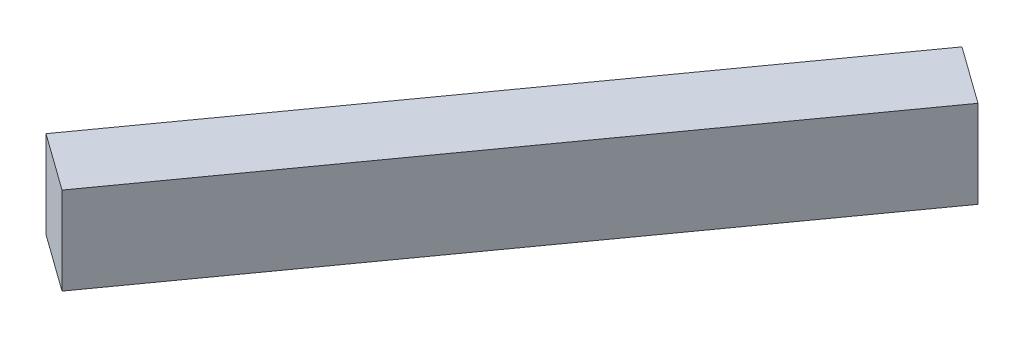
ISO-10303-21;
HEADER;
FILE_DESCRIPTION(('STEP AP214'),'2;1');
FILE_NAME('part.step','',(''),(''),'','','');
FILE_SCHEMA(('AUTOMOTIVE_DESIGN { 1 0 10303 214 1 1 1 1 }'));
ENDSEC;
DATA;
#1=APPLICATION_CONTEXT('core data for automotive mechanical design processes');
#2=APPLICATION_PROTOCOL_DEFINITION('international standard','automotive_design',2000,#1);
#3=PRODUCT_CONTEXT('',#1,'mechanical');
#4=PRODUCT('Part','Part','',(#3));
#5=PRODUCT_RELATED_PRODUCT_CATEGORY('part','',(#4));
#6=PRODUCT_DEFINITION_FORMATION('','',#4);
#7=PRODUCT_DEFINITION_CONTEXT('part definition',#1,'design');
#8=PRODUCT_DEFINITION('design','',#6,#7);
#9=PRODUCT_DEFINITION_SHAPE('','',#8);
#10=(LENGTH_UNIT() NAMED_UNIT(*) SI_UNIT(.MILLI.,.METRE.));
#11=(NAMED_UNIT(*) PLANE_ANGLE_UNIT() SI_UNIT($,.RADIAN.));
#12=(NAMED_UNIT(*) SI_UNIT($,.STERADIAN.) SOLID_ANGLE_UNIT());
#13=UNCERTAINTY_MEASURE_WITH_UNIT(LENGTH_MEASURE(1.E-05),#10,'distance_accuracy_value','');
#14=(GEOMETRIC_REPRESENTATION_CONTEXT(3) GLOBAL_UNCERTAINTY_ASSIGNED_CONTEXT((#13)) GLOBAL_UNIT_ASSIGNED_CONTEXT((#10,
#11,#12)) REPRESENTATION_CONTEXT('',''));
#15=CARTESIAN_POINT('',(0.,0.,0.));
#16=DIRECTION('',(0.,0.,1.));
#17=DIRECTION('',(1.,0.,0.));
#18=AXIS2_PLACEMENT_3D('',#15,#16,#17);
#19=CARTESIAN_POINT('',(10.4156583664926,7.874,-14.6777818352917));
#20=DIRECTION('',(0.812300744526054,0.,0.583238802243488));
#21=DIRECTION('',(0.583238802243488,0.,-0.812300744526054));
#22=AXIS2_PLACEMENT_3D('',#19,#20,#21);
#23=PLANE('',#22);
#24=DIRECTION('',(0.,1.,0.));
#25=VECTOR('',#24,1.);
#26=CARTESIAN_POINT('',(10.4156583664926,7.874,-14.6777818352917));
#27=LINE('',#26,#25);
#28=CARTESIAN_POINT('',(10.4156583664926,7.62,-14.6777818352917));
#29=VERTEX_POINT('',#28);
#30=CARTESIAN_POINT('',(10.4156583664926,7.874,-14.6777818352917));
#31=VERTEX_POINT('',#30);
#32=EDGE_CURVE('E20',#29,#31,#27,.T.);
#33=ORIENTED_EDGE('',*,*,#32,.T.);
#34=DIRECTION('',(0.583238802243481,0.,-0.812300744526059));
#35=VECTOR('',#34,1.);
#36=CARTESIAN_POINT('',(10.4156583664926,7.874,-14.6777818352917));
#37=LINE('',#36,#35);
#38=CARTESIAN_POINT('',(11.5267282847664,7.874,-16.2252147536138));
#39=VERTEX_POINT('',#38);
#40=EDGE_CURVE('E55',#31,#39,#37,.T.);
#41=ORIENTED_EDGE('',*,*,#40,.T.);
#42=DIRECTION('',(0.,1.,0.));
#43=VECTOR('',#42,1.);
#44=CARTESIAN_POINT('',(11.5267282847664,7.874,-16.2252147536138));
#45=LINE('',#44,#43);
#46=CARTESIAN_POINT('',(11.5267282847664,7.62,-16.2252147536138));
#47=VERTEX_POINT('',#46);
#48=EDGE_CURVE('E76',#39,#47,#45,.F.);
#49=ORIENTED_EDGE('',*,*,#48,.T.);
#50=DIRECTION('',(0.583238802243481,0.,-0.812300744526059));
#51=VECTOR('',#50,1.);
#52=CARTESIAN_POINT('',(10.4156583664926,7.62,-14.6777818352917));
#53=LINE('',#52,#51);
#54=EDGE_CURVE('E58',#29,#47,#53,.T.);
#55=ORIENTED_EDGE('',*,*,#54,.F.);
#56=EDGE_LOOP('',(#33,#41,#49,#55));
#57=FACE_BOUND('',#56,.T.);
#58=ADVANCED_FACE('F17',(#57),#23,.F.);
#59=CARTESIAN_POINT('',(10.4156583664926,7.874,-14.6777818352917));
#60=DIRECTION('',(0.583238802243484,0.,-0.812300744526057));
#61=DIRECTION('',(-0.812300744526057,0.,-0.583238802243484));
#62=AXIS2_PLACEMENT_3D('',#59,#60,#61);
#63=PLANE('',#62);
#64=DIRECTION('',(0.,1.,0.));
#65=VECTOR('',#64,1.);
#66=CARTESIAN_POINT('',(10.5807178777803,7.874,-14.5592677106758));
#67=LINE('',#66,#65);
#68=CARTESIAN_POINT('',(10.5807178777803,7.62,-14.5592677106758));
#69=VERTEX_POINT('',#68);
#70=CARTESIAN_POINT('',(10.5807178777803,7.874,-14.5592677106758));
#71=VERTEX_POINT('',#70);
#72=EDGE_CURVE('E73',#69,#71,#67,.T.);
#73=ORIENTED_EDGE('',*,*,#72,.T.);
#74=DIRECTION('',(-0.812300744526004,0.,-0.583238802243557));
#75=VECTOR('',#74,1.);
#76=CARTESIAN_POINT('',(10.5807178777803,7.874,-14.5592677106758));
#77=LINE('',#76,#75);
#78=EDGE_CURVE('E63',#71,#31,#77,.T.);
#79=ORIENTED_EDGE('',*,*,#78,.T.);
#80=ORIENTED_EDGE('',*,*,#32,.F.);
#81=DIRECTION('',(-0.812300744526004,0.,-0.583238802243557));
#82=VECTOR('',#81,1.);
#83=CARTESIAN_POINT('',(10.5807178777803,7.62,-14.5592677106758));
#84=LINE('',#83,#82);
#85=EDGE_CURVE('E80',#69,#29,#84,.T.);
#86=ORIENTED_EDGE('',*,*,#85,.F.);
#87=EDGE_LOOP('',(#73,#79,#80,#86));
#88=FACE_BOUND('',#87,.T.);
#89=ADVANCED_FACE('F72',(#88),#63,.F.);
#90=CARTESIAN_POINT('',(10.4156583664926,7.874,-14.6777818352917));
#91=DIRECTION('',(0.,-1.,0.));
#92=DIRECTION('',(0.,0.,-1.));
#93=AXIS2_PLACEMENT_3D('',#90,#91,#92);
#94=PLANE('',#93);
#95=ORIENTED_EDGE('',*,*,#78,.F.);
#96=DIRECTION('',(-0.583238802243489,0.,0.812300744526053));
#97=VECTOR('',#96,1.);
#98=CARTESIAN_POINT('',(10.5807178777803,7.874,-14.5592677106758));
#99=LINE('',#98,#97);
#100=CARTESIAN_POINT('',(11.6917877962345,7.874,-16.1067006292492));
#101=VERTEX_POINT('',#100);
#102=EDGE_CURVE('E83',#71,#101,#99,.F.);
#103=ORIENTED_EDGE('',*,*,#102,.T.);
#104=DIRECTION('',(0.812300745413938,0.,0.583238801006896));
#105=VECTOR('',#104,1.);
#106=CARTESIAN_POINT('',(11.5267282847664,7.874,-16.2252147536138));
#107=LINE('',#106,#105);
#108=EDGE_CURVE('E69',#101,#39,#107,.F.);
#109=ORIENTED_EDGE('',*,*,#108,.T.);
#110=ORIENTED_EDGE('',*,*,#40,.F.);
#111=EDGE_LOOP('',(#95,#103,#109,#110));
#112=FACE_BOUND('',#111,.T.);
#113=ADVANCED_FACE('F66',(#112),#94,.F.);
#114=CARTESIAN_POINT('',(11.5267282847664,7.874,-16.2252147536138));
#115=DIRECTION('',(-0.583238801006896,0.,0.812300745413938));
#116=DIRECTION('',(0.812300745413938,0.,0.583238801006896));
#117=AXIS2_PLACEMENT_3D('',#114,#115,#116);
#118=PLANE('',#117);
#119=ORIENTED_EDGE('',*,*,#48,.F.);
#120=ORIENTED_EDGE('',*,*,#108,.F.);
#121=DIRECTION('',(0.,1.,0.));
#122=VECTOR('',#121,1.);
#123=CARTESIAN_POINT('',(11.6917877962345,7.874,-16.1067006292492));
#124=LINE('',#123,#122);
#125=CARTESIAN_POINT('',(11.6917877962345,7.62,-16.1067006292492));
#126=VERTEX_POINT('',#125);
#127=EDGE_CURVE('E26',#101,#126,#124,.F.);
#128=ORIENTED_EDGE('',*,*,#127,.T.);
#129=DIRECTION('',(0.812300745413925,0.,0.583238801006913));
#130=VECTOR('',#129,1.);
#131=CARTESIAN_POINT('',(11.5267282847664,7.62,-16.2252147536138));
#132=LINE('',#131,#130);
#133=EDGE_CURVE('E34',#47,#126,#132,.T.);
#134=ORIENTED_EDGE('',*,*,#133,.F.);
#135=EDGE_LOOP('',(#119,#120,#128,#134));
#136=FACE_BOUND('',#135,.T.);
#137=ADVANCED_FACE('F88',(#136),#118,.F.);
#138=CARTESIAN_POINT('',(10.4156583664926,7.62,-14.6777818352917));
#139=DIRECTION('',(0.,-1.,0.));
#140=DIRECTION('',(0.,0.,-1.));
#141=AXIS2_PLACEMENT_3D('',#138,#139,#140);
#142=PLANE('',#141);
#143=DIRECTION('',(-0.583238802243489,0.,0.812300744526053));
#144=VECTOR('',#143,1.);
#145=CARTESIAN_POINT('',(10.5807178777803,7.62,-14.5592677106758));
#146=LINE('',#145,#144);
#147=EDGE_CURVE('E11',#126,#69,#146,.T.);
#148=ORIENTED_EDGE('',*,*,#147,.T.);
#149=ORIENTED_EDGE('',*,*,#85,.T.);
#150=ORIENTED_EDGE('',*,*,#54,.T.);
#151=ORIENTED_EDGE('',*,*,#133,.T.);
#152=EDGE_LOOP('',(#148,#149,#150,#151));
#153=FACE_BOUND('',#152,.T.);
#154=ADVANCED_FACE('F91',(#153),#142,.T.);
#155=CARTESIAN_POINT('',(10.5807178777803,7.874,-14.5592677106758));
#156=DIRECTION('',(-0.812300744526053,0.,-0.583238802243489));
#157=DIRECTION('',(-0.583238802243489,0.,0.812300744526053));
#158=AXIS2_PLACEMENT_3D('',#155,#156,#157);
#159=PLANE('',#158);
#160=ORIENTED_EDGE('',*,*,#127,.F.);
#161=ORIENTED_EDGE('',*,*,#102,.F.);
#162=ORIENTED_EDGE('',*,*,#72,.F.);
#163=ORIENTED_EDGE('',*,*,#147,.F.);
#164=EDGE_LOOP('',(#160,#161,#162,#163));
#165=FACE_BOUND('',#164,.T.);
#166=ADVANCED_FACE('F90',(#165),#159,.F.);
#167=CLOSED_SHELL('',(#58,#89,#113,#137,#154,#166));
#168=MANIFOLD_SOLID_BREP('B1',#167);
#169=ADVANCED_BREP_SHAPE_REPRESENTATION('',(#18,#168),#14);
#170=SHAPE_DEFINITION_REPRESENTATION(#9,#169);
ENDSEC;
END-ISO-10303-21;
